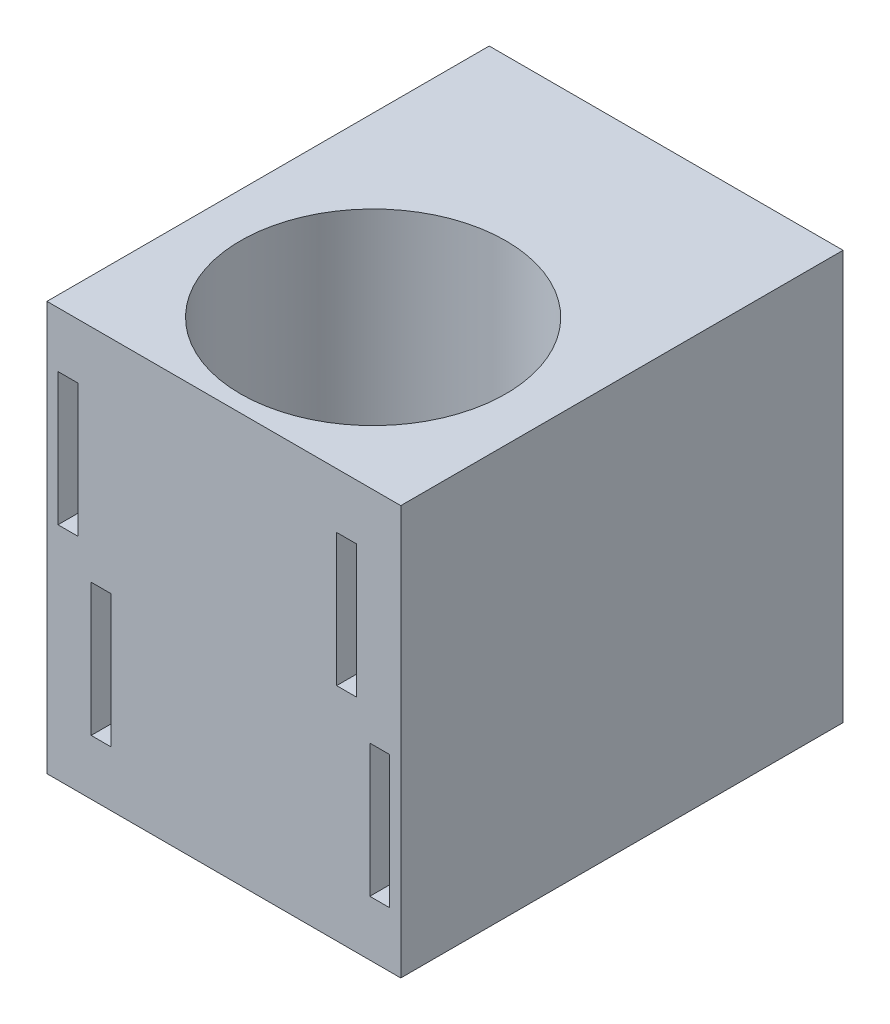
ISO-10303-21;
HEADER;
FILE_DESCRIPTION(('STEP AP214'),'2;1');
FILE_NAME('part.step','',(''),(''),'','','');
FILE_SCHEMA(('AUTOMOTIVE_DESIGN { 1 0 10303 214 1 1 1 1 }'));
ENDSEC;
DATA;
#1=APPLICATION_CONTEXT('core data for automotive mechanical design processes');
#2=APPLICATION_PROTOCOL_DEFINITION('international standard','automotive_design',2000,#1);
#3=PRODUCT_CONTEXT('',#1,'mechanical');
#4=PRODUCT('Part','Part','',(#3));
#5=PRODUCT_RELATED_PRODUCT_CATEGORY('part','',(#4));
#6=PRODUCT_DEFINITION_FORMATION('','',#4);
#7=PRODUCT_DEFINITION_CONTEXT('part definition',#1,'design');
#8=PRODUCT_DEFINITION('design','',#6,#7);
#9=PRODUCT_DEFINITION_SHAPE('','',#8);
#10=(LENGTH_UNIT() NAMED_UNIT(*) SI_UNIT(.MILLI.,.METRE.));
#11=(NAMED_UNIT(*) PLANE_ANGLE_UNIT() SI_UNIT($,.RADIAN.));
#12=(NAMED_UNIT(*) SI_UNIT($,.STERADIAN.) SOLID_ANGLE_UNIT());
#13=UNCERTAINTY_MEASURE_WITH_UNIT(LENGTH_MEASURE(1.E-05),#10,'distance_accuracy_value','');
#14=(GEOMETRIC_REPRESENTATION_CONTEXT(3) GLOBAL_UNCERTAINTY_ASSIGNED_CONTEXT((#13)) GLOBAL_UNIT_ASSIGNED_CONTEXT((#10,
#11,#12)) REPRESENTATION_CONTEXT('',''));
#15=CARTESIAN_POINT('',(0.,0.,0.));
#16=DIRECTION('',(0.,0.,1.));
#17=DIRECTION('',(1.,0.,0.));
#18=AXIS2_PLACEMENT_3D('',#15,#16,#17);
#19=CARTESIAN_POINT('',(-16.,30.,-13.5));
#20=DIRECTION('',(1.,0.,0.));
#21=DIRECTION('',(0.,0.,-1.));
#22=AXIS2_PLACEMENT_3D('',#19,#20,#21);
#23=PLANE('',#22);
#24=DIRECTION('',(0.,1.,0.));
#25=VECTOR('',#24,1.);
#26=CARTESIAN_POINT('',(-16.,0.,-26.5));
#27=LINE('',#26,#25);
#28=CARTESIAN_POINT('',(-16.,-3.5,-26.5));
#29=VERTEX_POINT('',#28);
#30=CARTESIAN_POINT('',(-16.,33.5,-26.5));
#31=VERTEX_POINT('',#30);
#32=EDGE_CURVE('E186',#29,#31,#27,.T.);
#33=ORIENTED_EDGE('',*,*,#32,.F.);
#34=DIRECTION('',(0.,0.,-1.));
#35=VECTOR('',#34,1.);
#36=CARTESIAN_POINT('',(-16.,-3.5,13.5));
#37=LINE('',#36,#35);
#38=CARTESIAN_POINT('',(-16.,-3.5,13.5));
#39=VERTEX_POINT('',#38);
#40=EDGE_CURVE('E185',#39,#29,#37,.T.);
#41=ORIENTED_EDGE('',*,*,#40,.F.);
#42=DIRECTION('',(0.,-1.,0.));
#43=VECTOR('',#42,1.);
#44=CARTESIAN_POINT('',(-16.,30.,13.5));
#45=LINE('',#44,#43);
#46=CARTESIAN_POINT('',(-16.,33.5,13.5));
#47=VERTEX_POINT('',#46);
#48=EDGE_CURVE('E171',#47,#39,#45,.T.);
#49=ORIENTED_EDGE('',*,*,#48,.F.);
#50=DIRECTION('',(0.,0.,1.));
#51=VECTOR('',#50,1.);
#52=CARTESIAN_POINT('',(-16.,33.5,-26.5));
#53=LINE('',#52,#51);
#54=EDGE_CURVE('E210',#31,#47,#53,.T.);
#55=ORIENTED_EDGE('',*,*,#54,.F.);
#56=EDGE_LOOP('',(#33,#41,#49,#55));
#57=FACE_BOUND('',#56,.T.);
#58=ADVANCED_FACE('F35',(#57),#23,.F.);
#59=CARTESIAN_POINT('',(16.,30.,13.5));
#60=DIRECTION('',(0.,0.,-1.));
#61=DIRECTION('',(-1.,0.,0.));
#62=AXIS2_PLACEMENT_3D('',#59,#60,#61);
#63=PLANE('',#62);
#64=DIRECTION('',(1.,0.,0.));
#65=VECTOR('',#64,1.);
#66=CARTESIAN_POINT('',(13.2,1.5,13.5));
#67=LINE('',#66,#65);
#68=CARTESIAN_POINT('',(13.2,1.5,13.5));
#69=VERTEX_POINT('',#68);
#70=CARTESIAN_POINT('',(15.,1.5,13.5));
#71=VERTEX_POINT('',#70);
#72=EDGE_CURVE('E244',#69,#71,#67,.T.);
#73=ORIENTED_EDGE('',*,*,#72,.F.);
#74=DIRECTION('',(0.,-1.,0.));
#75=VECTOR('',#74,1.);
#76=CARTESIAN_POINT('',(13.2,13.5,13.5));
#77=LINE('',#76,#75);
#78=CARTESIAN_POINT('',(13.2,13.5,13.5));
#79=VERTEX_POINT('',#78);
#80=EDGE_CURVE('E49',#79,#69,#77,.T.);
#81=ORIENTED_EDGE('',*,*,#80,.F.);
#82=DIRECTION('',(-1.,0.,0.));
#83=VECTOR('',#82,1.);
#84=CARTESIAN_POINT('',(13.2,13.5,13.5));
#85=LINE('',#84,#83);
#86=CARTESIAN_POINT('',(15.,13.5,13.5));
#87=VERTEX_POINT('',#86);
#88=EDGE_CURVE('E250',#87,#79,#85,.T.);
#89=ORIENTED_EDGE('',*,*,#88,.F.);
#90=DIRECTION('',(0.,1.,0.));
#91=VECTOR('',#90,1.);
#92=CARTESIAN_POINT('',(15.,13.5,13.5));
#93=LINE('',#92,#91);
#94=EDGE_CURVE('E247',#71,#87,#93,.T.);
#95=ORIENTED_EDGE('',*,*,#94,.F.);
#96=EDGE_LOOP('',(#73,#81,#89,#95));
#97=FACE_BOUND('',#96,.T.);
#98=DIRECTION('',(1.,0.,0.));
#99=VECTOR('',#98,1.);
#100=CARTESIAN_POINT('',(-15.,16.5,13.5));
#101=LINE('',#100,#99);
#102=CARTESIAN_POINT('',(-15.,16.5,13.5));
#103=VERTEX_POINT('',#102);
#104=CARTESIAN_POINT('',(-13.2,16.5,13.5));
#105=VERTEX_POINT('',#104);
#106=EDGE_CURVE('E262',#103,#105,#101,.T.);
#107=ORIENTED_EDGE('',*,*,#106,.F.);
#108=DIRECTION('',(0.,-1.,0.));
#109=VECTOR('',#108,1.);
#110=CARTESIAN_POINT('',(-15.,28.5,13.5));
#111=LINE('',#110,#109);
#112=CARTESIAN_POINT('',(-15.,28.5,13.5));
#113=VERTEX_POINT('',#112);
#114=EDGE_CURVE('E57',#113,#103,#111,.T.);
#115=ORIENTED_EDGE('',*,*,#114,.F.);
#116=DIRECTION('',(-1.,0.,0.));
#117=VECTOR('',#116,1.);
#118=CARTESIAN_POINT('',(-15.,28.5,13.5));
#119=LINE('',#118,#117);
#120=CARTESIAN_POINT('',(-13.2,28.5,13.5));
#121=VERTEX_POINT('',#120);
#122=EDGE_CURVE('E268',#121,#113,#119,.T.);
#123=ORIENTED_EDGE('',*,*,#122,.F.);
#124=DIRECTION('',(0.,1.,0.));
#125=VECTOR('',#124,1.);
#126=CARTESIAN_POINT('',(-13.2,28.5,13.5));
#127=LINE('',#126,#125);
#128=EDGE_CURVE('E265',#105,#121,#127,.T.);
#129=ORIENTED_EDGE('',*,*,#128,.F.);
#130=EDGE_LOOP('',(#107,#115,#123,#129));
#131=FACE_BOUND('',#130,.T.);
#132=DIRECTION('',(1.,0.,0.));
#133=VECTOR('',#132,1.);
#134=CARTESIAN_POINT('',(10.2,16.5,13.5));
#135=LINE('',#134,#133);
#136=CARTESIAN_POINT('',(10.2,16.5,13.5));
#137=VERTEX_POINT('',#136);
#138=CARTESIAN_POINT('',(12.,16.5,13.5));
#139=VERTEX_POINT('',#138);
#140=EDGE_CURVE('E286',#137,#139,#135,.T.);
#141=ORIENTED_EDGE('',*,*,#140,.F.);
#142=DIRECTION('',(0.,-1.,0.));
#143=VECTOR('',#142,1.);
#144=CARTESIAN_POINT('',(10.2,28.5,13.5));
#145=LINE('',#144,#143);
#146=CARTESIAN_POINT('',(10.2,28.5,13.5));
#147=VERTEX_POINT('',#146);
#148=EDGE_CURVE('E274',#147,#137,#145,.T.);
#149=ORIENTED_EDGE('',*,*,#148,.F.);
#150=DIRECTION('',(-1.,0.,0.));
#151=VECTOR('',#150,1.);
#152=CARTESIAN_POINT('',(10.2,28.5,13.5));
#153=LINE('',#152,#151);
#154=CARTESIAN_POINT('',(12.,28.5,13.5));
#155=VERTEX_POINT('',#154);
#156=EDGE_CURVE('E284',#155,#147,#153,.T.);
#157=ORIENTED_EDGE('',*,*,#156,.F.);
#158=DIRECTION('',(0.,1.,0.));
#159=VECTOR('',#158,1.);
#160=CARTESIAN_POINT('',(12.,28.5,13.5));
#161=LINE('',#160,#159);
#162=EDGE_CURVE('E289',#139,#155,#161,.T.);
#163=ORIENTED_EDGE('',*,*,#162,.F.);
#164=EDGE_LOOP('',(#141,#149,#157,#163));
#165=FACE_BOUND('',#164,.T.);
#166=DIRECTION('',(1.,0.,0.));
#167=VECTOR('',#166,1.);
#168=CARTESIAN_POINT('',(-12.,1.5,13.5));
#169=LINE('',#168,#167);
#170=CARTESIAN_POINT('',(-12.,1.49999999999999,13.5));
#171=VERTEX_POINT('',#170);
#172=CARTESIAN_POINT('',(-10.2,1.5,13.5));
#173=VERTEX_POINT('',#172);
#174=EDGE_CURVE('E309',#171,#173,#169,.T.);
#175=ORIENTED_EDGE('',*,*,#174,.F.);
#176=DIRECTION('',(0.,-1.,0.));
#177=VECTOR('',#176,1.);
#178=CARTESIAN_POINT('',(-12.,1.5,13.5));
#179=LINE('',#178,#177);
#180=CARTESIAN_POINT('',(-12.,13.5,13.5));
#181=VERTEX_POINT('',#180);
#182=EDGE_CURVE('E296',#181,#171,#179,.T.);
#183=ORIENTED_EDGE('',*,*,#182,.F.);
#184=DIRECTION('',(-1.,0.,0.));
#185=VECTOR('',#184,1.);
#186=CARTESIAN_POINT('',(-12.,13.5,13.5));
#187=LINE('',#186,#185);
#188=CARTESIAN_POINT('',(-10.2,13.5,13.5));
#189=VERTEX_POINT('',#188);
#190=EDGE_CURVE('E307',#189,#181,#187,.T.);
#191=ORIENTED_EDGE('',*,*,#190,.F.);
#192=DIRECTION('',(0.,1.,0.));
#193=VECTOR('',#192,1.);
#194=CARTESIAN_POINT('',(-10.2,1.5,13.5));
#195=LINE('',#194,#193);
#196=EDGE_CURVE('E312',#173,#189,#195,.T.);
#197=ORIENTED_EDGE('',*,*,#196,.F.);
#198=EDGE_LOOP('',(#175,#183,#191,#197));
#199=FACE_BOUND('',#198,.T.);
#200=ORIENTED_EDGE('',*,*,#48,.T.);
#201=DIRECTION('',(-1.,0.,0.));
#202=VECTOR('',#201,1.);
#203=CARTESIAN_POINT('',(16.,-3.5,13.5));
#204=LINE('',#203,#202);
#205=CARTESIAN_POINT('',(16.,-3.5,13.5));
#206=VERTEX_POINT('',#205);
#207=EDGE_CURVE('E175',#206,#39,#204,.T.);
#208=ORIENTED_EDGE('',*,*,#207,.F.);
#209=DIRECTION('',(0.,-1.,0.));
#210=VECTOR('',#209,1.);
#211=CARTESIAN_POINT('',(16.,30.,13.5));
#212=LINE('',#211,#210);
#213=CARTESIAN_POINT('',(16.,33.5,13.5));
#214=VERTEX_POINT('',#213);
#215=EDGE_CURVE('E182',#214,#206,#212,.T.);
#216=ORIENTED_EDGE('',*,*,#215,.F.);
#217=DIRECTION('',(1.,0.,0.));
#218=VECTOR('',#217,1.);
#219=CARTESIAN_POINT('',(-16.,33.5,13.5));
#220=LINE('',#219,#218);
#221=EDGE_CURVE('E177',#47,#214,#220,.T.);
#222=ORIENTED_EDGE('',*,*,#221,.F.);
#223=EDGE_LOOP('',(#200,#208,#216,#222));
#224=FACE_BOUND('',#223,.T.);
#225=ADVANCED_FACE('F173',(#97,#131,#165,#199,#224),#63,.F.);
#226=CARTESIAN_POINT('',(16.,30.,-13.5));
#227=DIRECTION('',(-1.,0.,0.));
#228=DIRECTION('',(0.,0.,1.));
#229=AXIS2_PLACEMENT_3D('',#226,#227,#228);
#230=PLANE('',#229);
#231=ORIENTED_EDGE('',*,*,#215,.T.);
#232=DIRECTION('',(0.,0.,1.));
#233=VECTOR('',#232,1.);
#234=CARTESIAN_POINT('',(16.,-3.5,-26.5));
#235=LINE('',#234,#233);
#236=CARTESIAN_POINT('',(16.,-3.5,-26.5));
#237=VERTEX_POINT('',#236);
#238=EDGE_CURVE('E196',#237,#206,#235,.T.);
#239=ORIENTED_EDGE('',*,*,#238,.F.);
#240=DIRECTION('',(0.,-1.,0.));
#241=VECTOR('',#240,1.);
#242=CARTESIAN_POINT('',(16.,30.,-26.5));
#243=LINE('',#242,#241);
#244=CARTESIAN_POINT('',(16.,33.5,-26.5));
#245=VERTEX_POINT('',#244);
#246=EDGE_CURVE('E240',#245,#237,#243,.T.);
#247=ORIENTED_EDGE('',*,*,#246,.F.);
#248=DIRECTION('',(0.,0.,-1.));
#249=VECTOR('',#248,1.);
#250=CARTESIAN_POINT('',(16.,33.5,13.5));
#251=LINE('',#250,#249);
#252=EDGE_CURVE('E213',#214,#245,#251,.T.);
#253=ORIENTED_EDGE('',*,*,#252,.F.);
#254=EDGE_LOOP('',(#231,#239,#247,#253));
#255=FACE_BOUND('',#254,.T.);
#256=ADVANCED_FACE('F372',(#255),#230,.F.);
#257=CARTESIAN_POINT('',(0.,30.,0.));
#258=DIRECTION('',(0.,-1.,0.));
#259=DIRECTION('',(0.,0.,-1.));
#260=AXIS2_PLACEMENT_3D('',#257,#258,#259);
#261=CYLINDRICAL_SURFACE('',#260,12.);
#262=CARTESIAN_POINT('',(0.,28.5,0.));
#263=DIRECTION('',(0.,1.,0.));
#264=DIRECTION('',(-1.,0.,0.));
#265=AXIS2_PLACEMENT_3D('',#262,#263,#264);
#266=CIRCLE('',#265,12.);
#267=CARTESIAN_POINT('',(10.2,28.5,6.32139225171165));
#268=VERTEX_POINT('',#267);
#269=CARTESIAN_POINT('',(12.,28.5,0.));
#270=VERTEX_POINT('',#269);
#271=EDGE_CURVE('E11',#268,#270,#266,.T.);
#272=ORIENTED_EDGE('',*,*,#271,.F.);
#273=DIRECTION('',(0.,-1.,0.));
#274=VECTOR('',#273,1.);
#275=CARTESIAN_POINT('',(10.2,30.,6.32139225171165));
#276=LINE('',#275,#274);
#277=CARTESIAN_POINT('',(10.2,16.5,6.32139225171164));
#278=VERTEX_POINT('',#277);
#279=EDGE_CURVE('E42',#278,#268,#276,.F.);
#280=ORIENTED_EDGE('',*,*,#279,.F.);
#281=CARTESIAN_POINT('',(0.,16.5,0.));
#282=DIRECTION('',(0.,-1.,0.));
#283=DIRECTION('',(0.,0.,-1.));
#284=AXIS2_PLACEMENT_3D('',#281,#282,#283);
#285=CIRCLE('',#284,12.);
#286=CARTESIAN_POINT('',(12.,16.5,0.));
#287=VERTEX_POINT('',#286);
#288=EDGE_CURVE('E332',#287,#278,#285,.T.);
#289=ORIENTED_EDGE('',*,*,#288,.F.);
#290=DIRECTION('',(0.,1.,0.));
#291=VECTOR('',#290,1.);
#292=CARTESIAN_POINT('',(12.,28.5,0.));
#293=LINE('',#292,#291);
#294=EDGE_CURVE('E280',#287,#270,#293,.T.);
#295=ORIENTED_EDGE('',*,*,#294,.T.);
#296=EDGE_LOOP('',(#272,#280,#289,#295));
#297=FACE_BOUND('',#296,.T.);
#298=CARTESIAN_POINT('',(0.,13.5,0.));
#299=DIRECTION('',(0.,1.,0.));
#300=DIRECTION('',(0.,0.,1.));
#301=AXIS2_PLACEMENT_3D('',#298,#299,#300);
#302=CIRCLE('',#301,12.);
#303=CARTESIAN_POINT('',(-12.,13.5,0.));
#304=VERTEX_POINT('',#303);
#305=CARTESIAN_POINT('',(-10.2,13.5,6.32139225171165));
#306=VERTEX_POINT('',#305);
#307=EDGE_CURVE('E330',#304,#306,#302,.T.);
#308=ORIENTED_EDGE('',*,*,#307,.F.);
#309=DIRECTION('',(0.,-1.,0.));
#310=VECTOR('',#309,1.);
#311=CARTESIAN_POINT('',(-12.,1.5,0.));
#312=LINE('',#311,#310);
#313=CARTESIAN_POINT('',(-12.,1.5,0.));
#314=VERTEX_POINT('',#313);
#315=EDGE_CURVE('E303',#304,#314,#312,.T.);
#316=ORIENTED_EDGE('',*,*,#315,.T.);
#317=CARTESIAN_POINT('',(0.,1.50000000000003,0.));
#318=DIRECTION('',(0.,-1.,0.));
#319=DIRECTION('',(1.,0.,0.));
#320=AXIS2_PLACEMENT_3D('',#317,#318,#319);
#321=CIRCLE('',#320,12.);
#322=CARTESIAN_POINT('',(-10.2,1.5,6.32139225171165));
#323=VERTEX_POINT('',#322);
#324=EDGE_CURVE('E181',#323,#314,#321,.T.);
#325=ORIENTED_EDGE('',*,*,#324,.F.);
#326=DIRECTION('',(0.,-1.,0.));
#327=VECTOR('',#326,1.);
#328=CARTESIAN_POINT('',(-10.2,30.,6.32139225171165));
#329=LINE('',#328,#327);
#330=EDGE_CURVE('E328',#306,#323,#329,.T.);
#331=ORIENTED_EDGE('',*,*,#330,.F.);
#332=EDGE_LOOP('',(#308,#316,#325,#331));
#333=FACE_BOUND('',#332,.T.);
#334=CARTESIAN_POINT('',(0.,33.5,0.));
#335=DIRECTION('',(0.,1.,0.));
#336=DIRECTION('',(0.,0.,1.));
#337=AXIS2_PLACEMENT_3D('',#334,#335,#336);
#338=CIRCLE('',#337,12.);
#339=CARTESIAN_POINT('',(0.,33.5,12.));
#340=VERTEX_POINT('',#339);
#341=EDGE_CURVE('E204',#340,#340,#338,.T.);
#342=ORIENTED_EDGE('',*,*,#341,.T.);
#343=EDGE_LOOP('',(#342));
#344=FACE_BOUND('',#343,.T.);
#345=CARTESIAN_POINT('',(0.,-3.5,0.));
#346=DIRECTION('',(0.,-1.,0.));
#347=DIRECTION('',(0.,0.,-1.));
#348=AXIS2_PLACEMENT_3D('',#345,#346,#347);
#349=CIRCLE('',#348,12.);
#350=CARTESIAN_POINT('',(0.,-3.5,-12.));
#351=VERTEX_POINT('',#350);
#352=EDGE_CURVE('E197',#351,#351,#349,.T.);
#353=ORIENTED_EDGE('',*,*,#352,.T.);
#354=EDGE_LOOP('',(#353));
#355=FACE_BOUND('',#354,.T.);
#356=ADVANCED_FACE('F345',(#297,#333,#344,#355),#261,.F.);
#357=CARTESIAN_POINT('',(-12.,1.5,0.));
#358=DIRECTION('',(-1.,0.,0.));
#359=DIRECTION('',(0.,0.,1.));
#360=AXIS2_PLACEMENT_3D('',#357,#358,#359);
#361=PLANE('',#360);
#362=ORIENTED_EDGE('',*,*,#182,.T.);
#363=DIRECTION('',(0.,0.,1.));
#364=VECTOR('',#363,1.);
#365=CARTESIAN_POINT('',(-12.,1.5,0.));
#366=LINE('',#365,#364);
#367=EDGE_CURVE('E306',#314,#171,#366,.T.);
#368=ORIENTED_EDGE('',*,*,#367,.F.);
#369=ORIENTED_EDGE('',*,*,#315,.F.);
#370=DIRECTION('',(0.,0.,1.));
#371=VECTOR('',#370,1.);
#372=CARTESIAN_POINT('',(-12.,13.5,0.));
#373=LINE('',#372,#371);
#374=EDGE_CURVE('E317',#304,#181,#373,.T.);
#375=ORIENTED_EDGE('',*,*,#374,.T.);
#376=EDGE_LOOP('',(#362,#368,#369,#375));
#377=FACE_BOUND('',#376,.T.);
#378=ADVANCED_FACE('F384',(#377),#361,.F.);
#379=CARTESIAN_POINT('',(-12.,13.5,0.));
#380=DIRECTION('',(0.,1.,0.));
#381=DIRECTION('',(0.,0.,1.));
#382=AXIS2_PLACEMENT_3D('',#379,#380,#381);
#383=PLANE('',#382);
#384=ORIENTED_EDGE('',*,*,#307,.T.);
#385=DIRECTION('',(0.,0.,1.));
#386=VECTOR('',#385,1.);
#387=CARTESIAN_POINT('',(-10.2,13.5,0.));
#388=LINE('',#387,#386);
#389=EDGE_CURVE('E319',#306,#189,#388,.T.);
#390=ORIENTED_EDGE('',*,*,#389,.T.);
#391=ORIENTED_EDGE('',*,*,#190,.T.);
#392=ORIENTED_EDGE('',*,*,#374,.F.);
#393=EDGE_LOOP('',(#384,#390,#391,#392));
#394=FACE_BOUND('',#393,.T.);
#395=ADVANCED_FACE('F387',(#394),#383,.F.);
#396=CARTESIAN_POINT('',(-10.2,1.5,0.));
#397=DIRECTION('',(1.,0.,0.));
#398=DIRECTION('',(0.,0.,-1.));
#399=AXIS2_PLACEMENT_3D('',#396,#397,#398);
#400=PLANE('',#399);
#401=ORIENTED_EDGE('',*,*,#330,.T.);
#402=DIRECTION('',(0.,0.,1.));
#403=VECTOR('',#402,1.);
#404=CARTESIAN_POINT('',(-10.2,1.5,0.));
#405=LINE('',#404,#403);
#406=EDGE_CURVE('E321',#323,#173,#405,.T.);
#407=ORIENTED_EDGE('',*,*,#406,.T.);
#408=ORIENTED_EDGE('',*,*,#196,.T.);
#409=ORIENTED_EDGE('',*,*,#389,.F.);
#410=EDGE_LOOP('',(#401,#407,#408,#409));
#411=FACE_BOUND('',#410,.T.);
#412=ADVANCED_FACE('F392',(#411),#400,.F.);
#413=CARTESIAN_POINT('',(-12.,1.5,0.));
#414=DIRECTION('',(0.,-1.,0.));
#415=DIRECTION('',(1.,0.,0.));
#416=AXIS2_PLACEMENT_3D('',#413,#414,#415);
#417=PLANE('',#416);
#418=ORIENTED_EDGE('',*,*,#324,.T.);
#419=ORIENTED_EDGE('',*,*,#367,.T.);
#420=ORIENTED_EDGE('',*,*,#174,.T.);
#421=ORIENTED_EDGE('',*,*,#406,.F.);
#422=EDGE_LOOP('',(#418,#419,#420,#421));
#423=FACE_BOUND('',#422,.T.);
#424=ADVANCED_FACE('F389',(#423),#417,.F.);
#425=CARTESIAN_POINT('',(10.2,28.5,0.));
#426=DIRECTION('',(-1.,0.,0.));
#427=DIRECTION('',(0.,-1.,0.));
#428=AXIS2_PLACEMENT_3D('',#425,#426,#427);
#429=PLANE('',#428);
#430=ORIENTED_EDGE('',*,*,#279,.T.);
#431=DIRECTION('',(0.,0.,1.));
#432=VECTOR('',#431,1.);
#433=CARTESIAN_POINT('',(10.2,28.5,0.));
#434=LINE('',#433,#432);
#435=EDGE_CURVE('E294',#268,#147,#434,.T.);
#436=ORIENTED_EDGE('',*,*,#435,.T.);
#437=ORIENTED_EDGE('',*,*,#148,.T.);
#438=DIRECTION('',(0.,0.,1.));
#439=VECTOR('',#438,1.);
#440=CARTESIAN_POINT('',(10.2,16.5,0.));
#441=LINE('',#440,#439);
#442=EDGE_CURVE('E283',#278,#137,#441,.T.);
#443=ORIENTED_EDGE('',*,*,#442,.F.);
#444=EDGE_LOOP('',(#430,#436,#437,#443));
#445=FACE_BOUND('',#444,.T.);
#446=ADVANCED_FACE('F337',(#445),#429,.F.);
#447=CARTESIAN_POINT('',(10.2,28.5,0.));
#448=DIRECTION('',(0.,1.,0.));
#449=DIRECTION('',(-1.,0.,0.));
#450=AXIS2_PLACEMENT_3D('',#447,#448,#449);
#451=PLANE('',#450);
#452=ORIENTED_EDGE('',*,*,#271,.T.);
#453=DIRECTION('',(0.,0.,1.));
#454=VECTOR('',#453,1.);
#455=CARTESIAN_POINT('',(12.,28.5,0.));
#456=LINE('',#455,#454);
#457=EDGE_CURVE('E297',#270,#155,#456,.T.);
#458=ORIENTED_EDGE('',*,*,#457,.T.);
#459=ORIENTED_EDGE('',*,*,#156,.T.);
#460=ORIENTED_EDGE('',*,*,#435,.F.);
#461=EDGE_LOOP('',(#452,#458,#459,#460));
#462=FACE_BOUND('',#461,.T.);
#463=ADVANCED_FACE('F342',(#462),#451,.F.);
#464=CARTESIAN_POINT('',(12.,28.5,0.));
#465=DIRECTION('',(1.,0.,0.));
#466=DIRECTION('',(0.,1.,0.));
#467=AXIS2_PLACEMENT_3D('',#464,#465,#466);
#468=PLANE('',#467);
#469=ORIENTED_EDGE('',*,*,#162,.T.);
#470=ORIENTED_EDGE('',*,*,#457,.F.);
#471=ORIENTED_EDGE('',*,*,#294,.F.);
#472=DIRECTION('',(0.,0.,1.));
#473=VECTOR('',#472,1.);
#474=CARTESIAN_POINT('',(12.,16.5,0.));
#475=LINE('',#474,#473);
#476=EDGE_CURVE('E299',#287,#139,#475,.T.);
#477=ORIENTED_EDGE('',*,*,#476,.T.);
#478=EDGE_LOOP('',(#469,#470,#471,#477));
#479=FACE_BOUND('',#478,.T.);
#480=ADVANCED_FACE('F349',(#479),#468,.F.);
#481=CARTESIAN_POINT('',(10.2,16.5,0.));
#482=DIRECTION('',(0.,-1.,0.));
#483=DIRECTION('',(0.,0.,-1.));
#484=AXIS2_PLACEMENT_3D('',#481,#482,#483);
#485=PLANE('',#484);
#486=ORIENTED_EDGE('',*,*,#288,.T.);
#487=ORIENTED_EDGE('',*,*,#442,.T.);
#488=ORIENTED_EDGE('',*,*,#140,.T.);
#489=ORIENTED_EDGE('',*,*,#476,.F.);
#490=EDGE_LOOP('',(#486,#487,#488,#489));
#491=FACE_BOUND('',#490,.T.);
#492=ADVANCED_FACE('F355',(#491),#485,.F.);
#493=CARTESIAN_POINT('',(-15.,28.5,-13.5));
#494=DIRECTION('',(-1.,0.,0.));
#495=DIRECTION('',(0.,0.,1.));
#496=AXIS2_PLACEMENT_3D('',#493,#494,#495);
#497=PLANE('',#496);
#498=ORIENTED_EDGE('',*,*,#114,.T.);
#499=DIRECTION('',(0.,0.,1.));
#500=VECTOR('',#499,1.);
#501=CARTESIAN_POINT('',(-15.,16.5,-13.5));
#502=LINE('',#501,#500);
#503=CARTESIAN_POINT('',(-15.,16.5,-26.5));
#504=VERTEX_POINT('',#503);
#505=EDGE_CURVE('E271',#504,#103,#502,.T.);
#506=ORIENTED_EDGE('',*,*,#505,.F.);
#507=DIRECTION('',(0.,1.,0.));
#508=VECTOR('',#507,1.);
#509=CARTESIAN_POINT('',(-15.,28.5,-26.5));
#510=LINE('',#509,#508);
#511=CARTESIAN_POINT('',(-15.,28.5,-26.5));
#512=VERTEX_POINT('',#511);
#513=EDGE_CURVE('E228',#504,#512,#510,.T.);
#514=ORIENTED_EDGE('',*,*,#513,.T.);
#515=DIRECTION('',(0.,0.,1.));
#516=VECTOR('',#515,1.);
#517=CARTESIAN_POINT('',(-15.,28.5,-13.5));
#518=LINE('',#517,#516);
#519=EDGE_CURVE('E272',#512,#113,#518,.T.);
#520=ORIENTED_EDGE('',*,*,#519,.T.);
#521=EDGE_LOOP('',(#498,#506,#514,#520));
#522=FACE_BOUND('',#521,.T.);
#523=ADVANCED_FACE('F357',(#522),#497,.F.);
#524=CARTESIAN_POINT('',(-15.,28.5,-13.5));
#525=DIRECTION('',(0.,1.,0.));
#526=DIRECTION('',(-1.,0.,0.));
#527=AXIS2_PLACEMENT_3D('',#524,#525,#526);
#528=PLANE('',#527);
#529=ORIENTED_EDGE('',*,*,#122,.T.);
#530=ORIENTED_EDGE('',*,*,#519,.F.);
#531=DIRECTION('',(1.,0.,0.));
#532=VECTOR('',#531,1.);
#533=CARTESIAN_POINT('',(-13.2,28.5,-26.5));
#534=LINE('',#533,#532);
#535=CARTESIAN_POINT('',(-13.2,28.5,-26.5));
#536=VERTEX_POINT('',#535);
#537=EDGE_CURVE('E231',#512,#536,#534,.T.);
#538=ORIENTED_EDGE('',*,*,#537,.T.);
#539=DIRECTION('',(0.,0.,1.));
#540=VECTOR('',#539,1.);
#541=CARTESIAN_POINT('',(-13.2,28.5,-13.5));
#542=LINE('',#541,#540);
#543=EDGE_CURVE('E275',#536,#121,#542,.T.);
#544=ORIENTED_EDGE('',*,*,#543,.T.);
#545=EDGE_LOOP('',(#529,#530,#538,#544));
#546=FACE_BOUND('',#545,.T.);
#547=ADVANCED_FACE('F363',(#546),#528,.F.);
#548=CARTESIAN_POINT('',(-13.2,28.5,-13.5));
#549=DIRECTION('',(1.,0.,0.));
#550=DIRECTION('',(0.,1.,0.));
#551=AXIS2_PLACEMENT_3D('',#548,#549,#550);
#552=PLANE('',#551);
#553=ORIENTED_EDGE('',*,*,#128,.T.);
#554=ORIENTED_EDGE('',*,*,#543,.F.);
#555=DIRECTION('',(0.,-1.,0.));
#556=VECTOR('',#555,1.);
#557=CARTESIAN_POINT('',(-13.2,16.5,-26.5));
#558=LINE('',#557,#556);
#559=CARTESIAN_POINT('',(-13.2,16.5,-26.5));
#560=VERTEX_POINT('',#559);
#561=EDGE_CURVE('E234',#536,#560,#558,.T.);
#562=ORIENTED_EDGE('',*,*,#561,.T.);
#563=DIRECTION('',(0.,0.,1.));
#564=VECTOR('',#563,1.);
#565=CARTESIAN_POINT('',(-13.2,16.5,-13.5));
#566=LINE('',#565,#564);
#567=EDGE_CURVE('E277',#560,#105,#566,.T.);
#568=ORIENTED_EDGE('',*,*,#567,.T.);
#569=EDGE_LOOP('',(#553,#554,#562,#568));
#570=FACE_BOUND('',#569,.T.);
#571=ADVANCED_FACE('F411',(#570),#552,.F.);
#572=CARTESIAN_POINT('',(-15.,16.5,-13.5));
#573=DIRECTION('',(0.,-1.,0.));
#574=DIRECTION('',(1.,0.,0.));
#575=AXIS2_PLACEMENT_3D('',#572,#573,#574);
#576=PLANE('',#575);
#577=ORIENTED_EDGE('',*,*,#106,.T.);
#578=ORIENTED_EDGE('',*,*,#567,.F.);
#579=DIRECTION('',(-1.,0.,0.));
#580=VECTOR('',#579,1.);
#581=CARTESIAN_POINT('',(-15.,16.5,-26.5));
#582=LINE('',#581,#580);
#583=EDGE_CURVE('E237',#560,#504,#582,.T.);
#584=ORIENTED_EDGE('',*,*,#583,.T.);
#585=ORIENTED_EDGE('',*,*,#505,.T.);
#586=EDGE_LOOP('',(#577,#578,#584,#585));
#587=FACE_BOUND('',#586,.T.);
#588=ADVANCED_FACE('F407',(#587),#576,.F.);
#589=CARTESIAN_POINT('',(13.2,13.5,-13.5));
#590=DIRECTION('',(-1.,0.,0.));
#591=DIRECTION('',(0.,-1.,0.));
#592=AXIS2_PLACEMENT_3D('',#589,#590,#591);
#593=PLANE('',#592);
#594=ORIENTED_EDGE('',*,*,#80,.T.);
#595=DIRECTION('',(0.,0.,1.));
#596=VECTOR('',#595,1.);
#597=CARTESIAN_POINT('',(13.2,1.5,-13.5));
#598=LINE('',#597,#596);
#599=CARTESIAN_POINT('',(13.2,1.5,-26.5));
#600=VERTEX_POINT('',#599);
#601=EDGE_CURVE('E253',#600,#69,#598,.T.);
#602=ORIENTED_EDGE('',*,*,#601,.F.);
#603=DIRECTION('',(0.,1.,0.));
#604=VECTOR('',#603,1.);
#605=CARTESIAN_POINT('',(13.2,13.5,-26.5));
#606=LINE('',#605,#604);
#607=CARTESIAN_POINT('',(13.2,13.5,-26.5));
#608=VERTEX_POINT('',#607);
#609=EDGE_CURVE('E225',#600,#608,#606,.T.);
#610=ORIENTED_EDGE('',*,*,#609,.T.);
#611=DIRECTION('',(0.,0.,1.));
#612=VECTOR('',#611,1.);
#613=CARTESIAN_POINT('',(13.2,13.5,-13.5));
#614=LINE('',#613,#612);
#615=EDGE_CURVE('E254',#608,#79,#614,.T.);
#616=ORIENTED_EDGE('',*,*,#615,.T.);
#617=EDGE_LOOP('',(#594,#602,#610,#616));
#618=FACE_BOUND('',#617,.T.);
#619=ADVANCED_FACE('F410',(#618),#593,.F.);
#620=CARTESIAN_POINT('',(13.2,13.5,-13.5));
#621=DIRECTION('',(0.,1.,0.));
#622=DIRECTION('',(0.,0.,1.));
#623=AXIS2_PLACEMENT_3D('',#620,#621,#622);
#624=PLANE('',#623);
#625=ORIENTED_EDGE('',*,*,#88,.T.);
#626=ORIENTED_EDGE('',*,*,#615,.F.);
#627=DIRECTION('',(1.,0.,0.));
#628=VECTOR('',#627,1.);
#629=CARTESIAN_POINT('',(15.,13.5,-26.5));
#630=LINE('',#629,#628);
#631=CARTESIAN_POINT('',(15.,13.5,-26.5));
#632=VERTEX_POINT('',#631);
#633=EDGE_CURVE('E216',#608,#632,#630,.T.);
#634=ORIENTED_EDGE('',*,*,#633,.T.);
#635=DIRECTION('',(0.,0.,1.));
#636=VECTOR('',#635,1.);
#637=CARTESIAN_POINT('',(15.,13.5,-13.5));
#638=LINE('',#637,#636);
#639=EDGE_CURVE('E256',#632,#87,#638,.T.);
#640=ORIENTED_EDGE('',*,*,#639,.T.);
#641=EDGE_LOOP('',(#625,#626,#634,#640));
#642=FACE_BOUND('',#641,.T.);
#643=ADVANCED_FACE('F421',(#642),#624,.F.);
#644=CARTESIAN_POINT('',(15.,13.5,-13.5));
#645=DIRECTION('',(1.,0.,0.));
#646=DIRECTION('',(0.,0.,-1.));
#647=AXIS2_PLACEMENT_3D('',#644,#645,#646);
#648=PLANE('',#647);
#649=ORIENTED_EDGE('',*,*,#94,.T.);
#650=ORIENTED_EDGE('',*,*,#639,.F.);
#651=DIRECTION('',(0.,-1.,0.));
#652=VECTOR('',#651,1.);
#653=CARTESIAN_POINT('',(15.,1.5,-26.5));
#654=LINE('',#653,#652);
#655=CARTESIAN_POINT('',(15.,1.5,-26.5));
#656=VERTEX_POINT('',#655);
#657=EDGE_CURVE('E219',#632,#656,#654,.T.);
#658=ORIENTED_EDGE('',*,*,#657,.T.);
#659=DIRECTION('',(0.,0.,1.));
#660=VECTOR('',#659,1.);
#661=CARTESIAN_POINT('',(15.,1.5,-13.5));
#662=LINE('',#661,#660);
#663=EDGE_CURVE('E258',#656,#71,#662,.T.);
#664=ORIENTED_EDGE('',*,*,#663,.T.);
#665=EDGE_LOOP('',(#649,#650,#658,#664));
#666=FACE_BOUND('',#665,.T.);
#667=ADVANCED_FACE('F425',(#666),#648,.F.);
#668=CARTESIAN_POINT('',(13.2,1.5,-13.5));
#669=DIRECTION('',(0.,-1.,0.));
#670=DIRECTION('',(0.,0.,-1.));
#671=AXIS2_PLACEMENT_3D('',#668,#669,#670);
#672=PLANE('',#671);
#673=ORIENTED_EDGE('',*,*,#72,.T.);
#674=ORIENTED_EDGE('',*,*,#663,.F.);
#675=DIRECTION('',(-1.,0.,0.));
#676=VECTOR('',#675,1.);
#677=CARTESIAN_POINT('',(13.2,1.5,-26.5));
#678=LINE('',#677,#676);
#679=EDGE_CURVE('E222',#656,#600,#678,.T.);
#680=ORIENTED_EDGE('',*,*,#679,.T.);
#681=ORIENTED_EDGE('',*,*,#601,.T.);
#682=EDGE_LOOP('',(#673,#674,#680,#681));
#683=FACE_BOUND('',#682,.T.);
#684=ADVANCED_FACE('F422',(#683),#672,.F.);
#685=CARTESIAN_POINT('',(0.,0.,-26.5));
#686=DIRECTION('',(0.,0.,-1.));
#687=DIRECTION('',(-1.,0.,0.));
#688=AXIS2_PLACEMENT_3D('',#685,#686,#687);
#689=PLANE('',#688);
#690=ORIENTED_EDGE('',*,*,#537,.F.);
#691=ORIENTED_EDGE('',*,*,#513,.F.);
#692=ORIENTED_EDGE('',*,*,#583,.F.);
#693=ORIENTED_EDGE('',*,*,#561,.F.);
#694=EDGE_LOOP('',(#690,#691,#692,#693));
#695=FACE_BOUND('',#694,.T.);
#696=ORIENTED_EDGE('',*,*,#246,.T.);
#697=DIRECTION('',(1.,0.,0.));
#698=VECTOR('',#697,1.);
#699=CARTESIAN_POINT('',(-16.,-3.5,-26.5));
#700=LINE('',#699,#698);
#701=EDGE_CURVE('E190',#29,#237,#700,.T.);
#702=ORIENTED_EDGE('',*,*,#701,.F.);
#703=ORIENTED_EDGE('',*,*,#32,.T.);
#704=DIRECTION('',(-1.,0.,0.));
#705=VECTOR('',#704,1.);
#706=CARTESIAN_POINT('',(16.,33.5,-26.5));
#707=LINE('',#706,#705);
#708=EDGE_CURVE('E207',#245,#31,#707,.T.);
#709=ORIENTED_EDGE('',*,*,#708,.F.);
#710=EDGE_LOOP('',(#696,#702,#703,#709));
#711=FACE_BOUND('',#710,.T.);
#712=ORIENTED_EDGE('',*,*,#657,.F.);
#713=ORIENTED_EDGE('',*,*,#633,.F.);
#714=ORIENTED_EDGE('',*,*,#609,.F.);
#715=ORIENTED_EDGE('',*,*,#679,.F.);
#716=EDGE_LOOP('',(#712,#713,#714,#715));
#717=FACE_BOUND('',#716,.T.);
#718=ADVANCED_FACE('F424',(#695,#711,#717),#689,.T.);
#719=CARTESIAN_POINT('',(0.,33.5,0.));
#720=DIRECTION('',(0.,1.,0.));
#721=DIRECTION('',(0.,0.,1.));
#722=AXIS2_PLACEMENT_3D('',#719,#720,#721);
#723=PLANE('',#722);
#724=ORIENTED_EDGE('',*,*,#708,.T.);
#725=ORIENTED_EDGE('',*,*,#54,.T.);
#726=ORIENTED_EDGE('',*,*,#221,.T.);
#727=ORIENTED_EDGE('',*,*,#252,.T.);
#728=EDGE_LOOP('',(#724,#725,#726,#727));
#729=FACE_BOUND('',#728,.T.);
#730=ORIENTED_EDGE('',*,*,#341,.F.);
#731=EDGE_LOOP('',(#730));
#732=FACE_BOUND('',#731,.T.);
#733=ADVANCED_FACE('F435',(#729,#732),#723,.T.);
#734=CARTESIAN_POINT('',(0.,-3.5,0.));
#735=DIRECTION('',(0.,-1.,0.));
#736=DIRECTION('',(0.,0.,-1.));
#737=AXIS2_PLACEMENT_3D('',#734,#735,#736);
#738=PLANE('',#737);
#739=ORIENTED_EDGE('',*,*,#207,.T.);
#740=ORIENTED_EDGE('',*,*,#40,.T.);
#741=ORIENTED_EDGE('',*,*,#701,.T.);
#742=ORIENTED_EDGE('',*,*,#238,.T.);
#743=EDGE_LOOP('',(#739,#740,#741,#742));
#744=FACE_BOUND('',#743,.T.);
#745=ORIENTED_EDGE('',*,*,#352,.F.);
#746=EDGE_LOOP('',(#745));
#747=FACE_BOUND('',#746,.T.);
#748=ADVANCED_FACE('F193',(#744,#747),#738,.T.);
#749=CLOSED_SHELL('',(#58,#225,#256,#356,#378,#395,#412,#424,#446,#463,#480,#492,#523,#547,#571,
#588,#619,#643,#667,#684,#718,#733,#748));
#750=MANIFOLD_SOLID_BREP('B2',#749);
#751=ADVANCED_BREP_SHAPE_REPRESENTATION('',(#18,#750),#14);
#752=SHAPE_DEFINITION_REPRESENTATION(#9,#751);
ENDSEC;
END-ISO-10303-21;
